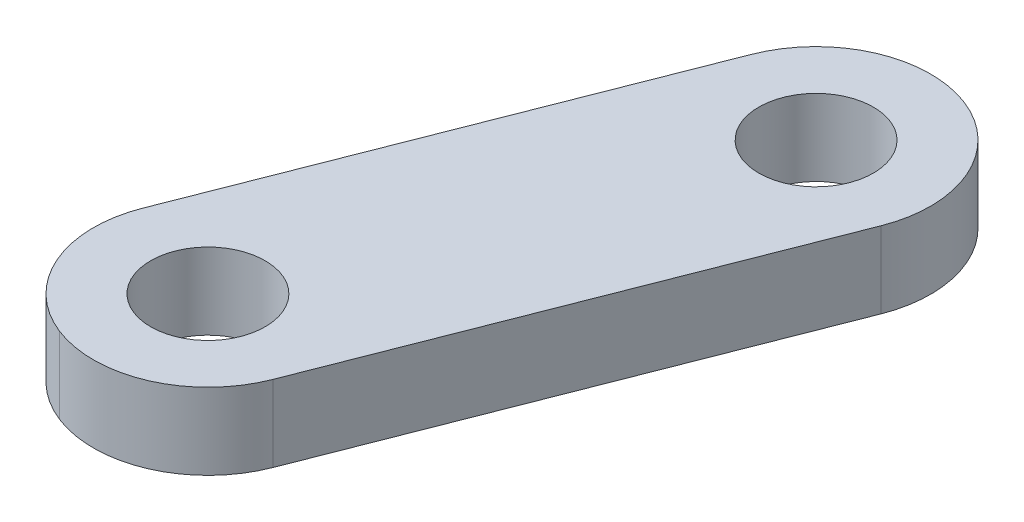
ISO-10303-21;
HEADER;
FILE_DESCRIPTION(('STEP AP214'),'2;1');
FILE_NAME('part.step','',(''),(''),'','','');
FILE_SCHEMA(('AUTOMOTIVE_DESIGN { 1 0 10303 214 1 1 1 1 }'));
ENDSEC;
DATA;
#1=APPLICATION_CONTEXT('core data for automotive mechanical design processes');
#2=APPLICATION_PROTOCOL_DEFINITION('international standard','automotive_design',2000,#1);
#3=PRODUCT_CONTEXT('',#1,'mechanical');
#4=PRODUCT('Part','Part','',(#3));
#5=PRODUCT_RELATED_PRODUCT_CATEGORY('part','',(#4));
#6=PRODUCT_DEFINITION_FORMATION('','',#4);
#7=PRODUCT_DEFINITION_CONTEXT('part definition',#1,'design');
#8=PRODUCT_DEFINITION('design','',#6,#7);
#9=PRODUCT_DEFINITION_SHAPE('','',#8);
#10=(LENGTH_UNIT() NAMED_UNIT(*) SI_UNIT(.MILLI.,.METRE.));
#11=(NAMED_UNIT(*) PLANE_ANGLE_UNIT() SI_UNIT($,.RADIAN.));
#12=(NAMED_UNIT(*) SI_UNIT($,.STERADIAN.) SOLID_ANGLE_UNIT());
#13=UNCERTAINTY_MEASURE_WITH_UNIT(LENGTH_MEASURE(1.E-05),#10,'distance_accuracy_value','');
#14=(GEOMETRIC_REPRESENTATION_CONTEXT(3) GLOBAL_UNCERTAINTY_ASSIGNED_CONTEXT((#13)) GLOBAL_UNIT_ASSIGNED_CONTEXT((#10,
#11,#12)) REPRESENTATION_CONTEXT('',''));
#15=CARTESIAN_POINT('',(0.,0.,0.));
#16=DIRECTION('',(0.,0.,1.));
#17=DIRECTION('',(1.,0.,0.));
#18=AXIS2_PLACEMENT_3D('',#15,#16,#17);
#19=CARTESIAN_POINT('',(0.,6.35,0.));
#20=DIRECTION('',(0.,1.,0.));
#21=DIRECTION('',(0.,0.,1.));
#22=AXIS2_PLACEMENT_3D('',#19,#20,#21);
#23=PLANE('',#22);
#24=CARTESIAN_POINT('',(159.170346838634,6.35,59.494925525367));
#25=DIRECTION('',(0.,1.,0.));
#26=DIRECTION('',(0.,0.,1.));
#27=AXIS2_PLACEMENT_3D('',#24,#25,#26);
#28=CIRCLE('',#27,4.76250000000001);
#29=CARTESIAN_POINT('',(159.170346838634,6.35,64.257425525367));
#30=VERTEX_POINT('',#29);
#31=EDGE_CURVE('E118',#30,#30,#28,.T.);
#32=ORIENTED_EDGE('',*,*,#31,.F.);
#33=EDGE_LOOP('',(#32));
#34=FACE_BOUND('',#33,.T.);
#35=CARTESIAN_POINT('',(144.947006010993,6.35,95.8543294001368));
#36=DIRECTION('',(0.,1.,0.));
#37=DIRECTION('',(0.,0.,1.));
#38=AXIS2_PLACEMENT_3D('',#35,#36,#37);
#39=CIRCLE('',#38,9.525);
#40=CARTESIAN_POINT('',(136.076566564707,6.35,92.3843252171742));
#41=VERTEX_POINT('',#40);
#42=CARTESIAN_POINT('',(141.47700182803,6.35,104.724768846423));
#43=VERTEX_POINT('',#42);
#44=EDGE_CURVE('E50',#41,#43,#39,.T.);
#45=ORIENTED_EDGE('',*,*,#44,.T.);
#46=CARTESIAN_POINT('',(144.947006010993,6.35,95.8543294001368));
#47=DIRECTION('',(0.,1.,0.));
#48=DIRECTION('',(0.,0.,1.));
#49=AXIS2_PLACEMENT_3D('',#46,#47,#48);
#50=CIRCLE('',#49,9.525);
#51=CARTESIAN_POINT('',(153.817445457278,6.35,99.3243335830994));
#52=VERTEX_POINT('',#51);
#53=EDGE_CURVE('E131',#43,#52,#50,.T.);
#54=ORIENTED_EDGE('',*,*,#53,.T.);
#55=DIRECTION('',(0.364304901098435,0.,-0.931279731893516));
#56=VECTOR('',#55,1.);
#57=CARTESIAN_POINT('',(171.510790467882,6.35,54.0944902620439));
#58=LINE('',#57,#56);
#59=CARTESIAN_POINT('',(168.04078628492,6.35,62.9649297083296));
#60=VERTEX_POINT('',#59);
#61=EDGE_CURVE('E107',#52,#60,#58,.T.);
#62=ORIENTED_EDGE('',*,*,#61,.T.);
#63=CARTESIAN_POINT('',(159.170346838634,6.35,59.494925525367));
#64=DIRECTION('',(0.,1.,0.));
#65=DIRECTION('',(0.,0.,1.));
#66=AXIS2_PLACEMENT_3D('',#63,#64,#65);
#67=CIRCLE('',#66,9.525);
#68=CARTESIAN_POINT('',(162.640351021597,6.35,50.6244860790813));
#69=VERTEX_POINT('',#68);
#70=EDGE_CURVE('E97',#60,#69,#67,.T.);
#71=ORIENTED_EDGE('',*,*,#70,.T.);
#72=CARTESIAN_POINT('',(159.170346838634,6.35,59.494925525367));
#73=DIRECTION('',(0.,1.,0.));
#74=DIRECTION('',(0.,0.,1.));
#75=AXIS2_PLACEMENT_3D('',#72,#73,#74);
#76=CIRCLE('',#75,9.525);
#77=CARTESIAN_POINT('',(150.299907392348,6.35,56.0249213424044));
#78=VERTEX_POINT('',#77);
#79=EDGE_CURVE('E128',#69,#78,#76,.T.);
#80=ORIENTED_EDGE('',*,*,#79,.T.);
#81=DIRECTION('',(-0.364304901098434,0.,0.931279731893517));
#82=VECTOR('',#81,1.);
#83=CARTESIAN_POINT('',(153.769911575311,6.35,47.1544818961187));
#84=LINE('',#83,#82);
#85=EDGE_CURVE('E114',#78,#41,#84,.T.);
#86=ORIENTED_EDGE('',*,*,#85,.T.);
#87=EDGE_LOOP('',(#45,#54,#62,#71,#80,#86));
#88=FACE_BOUND('',#87,.T.);
#89=CARTESIAN_POINT('',(144.947006010992,6.35,95.8543294001368));
#90=DIRECTION('',(0.,1.,0.));
#91=DIRECTION('',(0.,0.,1.));
#92=AXIS2_PLACEMENT_3D('',#89,#90,#91);
#93=CIRCLE('',#92,4.76250000000001);
#94=CARTESIAN_POINT('',(144.947006010992,6.35,100.616829400137));
#95=VERTEX_POINT('',#94);
#96=EDGE_CURVE('E136',#95,#95,#93,.T.);
#97=ORIENTED_EDGE('',*,*,#96,.F.);
#98=EDGE_LOOP('',(#97));
#99=FACE_BOUND('',#98,.T.);
#100=ADVANCED_FACE('F33',(#34,#88,#99),#23,.T.);
#101=CARTESIAN_POINT('',(0.,0.,0.));
#102=DIRECTION('',(0.,1.,0.));
#103=DIRECTION('',(0.,0.,1.));
#104=AXIS2_PLACEMENT_3D('',#101,#102,#103);
#105=PLANE('',#104);
#106=DIRECTION('',(0.364304901098435,0.,-0.931279731893516));
#107=VECTOR('',#106,1.);
#108=CARTESIAN_POINT('',(171.510790467882,0.,54.0944902620439));
#109=LINE('',#108,#107);
#110=CARTESIAN_POINT('',(153.817445457278,0.,99.3243335830994));
#111=VERTEX_POINT('',#110);
#112=CARTESIAN_POINT('',(168.04078628492,0.,62.9649297083296));
#113=VERTEX_POINT('',#112);
#114=EDGE_CURVE('E104',#111,#113,#109,.T.);
#115=ORIENTED_EDGE('',*,*,#114,.F.);
#116=CARTESIAN_POINT('',(144.947006010993,0.,95.8543294001368));
#117=DIRECTION('',(0.,1.,0.));
#118=DIRECTION('',(0.,0.,1.));
#119=AXIS2_PLACEMENT_3D('',#116,#117,#118);
#120=CIRCLE('',#119,9.525);
#121=CARTESIAN_POINT('',(141.47700182803,0.,104.724768846423));
#122=VERTEX_POINT('',#121);
#123=EDGE_CURVE('E88',#111,#122,#120,.F.);
#124=ORIENTED_EDGE('',*,*,#123,.T.);
#125=CARTESIAN_POINT('',(144.947006010993,0.,95.8543294001368));
#126=DIRECTION('',(0.,1.,0.));
#127=DIRECTION('',(0.,0.,1.));
#128=AXIS2_PLACEMENT_3D('',#125,#126,#127);
#129=CIRCLE('',#128,9.525);
#130=CARTESIAN_POINT('',(136.076566564707,0.,92.3843252171742));
#131=VERTEX_POINT('',#130);
#132=EDGE_CURVE('E98',#122,#131,#129,.F.);
#133=ORIENTED_EDGE('',*,*,#132,.T.);
#134=DIRECTION('',(-0.364304901098434,0.,0.931279731893517));
#135=VECTOR('',#134,1.);
#136=CARTESIAN_POINT('',(153.769911575311,0.,47.1544818961187));
#137=LINE('',#136,#135);
#138=CARTESIAN_POINT('',(150.299907392348,0.,56.0249213424044));
#139=VERTEX_POINT('',#138);
#140=EDGE_CURVE('E115',#139,#131,#137,.T.);
#141=ORIENTED_EDGE('',*,*,#140,.F.);
#142=CARTESIAN_POINT('',(159.170346838634,0.,59.494925525367));
#143=DIRECTION('',(0.,1.,0.));
#144=DIRECTION('',(0.,0.,1.));
#145=AXIS2_PLACEMENT_3D('',#142,#143,#144);
#146=CIRCLE('',#145,9.525);
#147=CARTESIAN_POINT('',(162.640351021597,0.,50.6244860790813));
#148=VERTEX_POINT('',#147);
#149=EDGE_CURVE('E124',#139,#148,#146,.F.);
#150=ORIENTED_EDGE('',*,*,#149,.T.);
#151=CARTESIAN_POINT('',(159.170346838634,0.,59.494925525367));
#152=DIRECTION('',(0.,1.,0.));
#153=DIRECTION('',(0.,0.,1.));
#154=AXIS2_PLACEMENT_3D('',#151,#152,#153);
#155=CIRCLE('',#154,9.525);
#156=EDGE_CURVE('E108',#148,#113,#155,.F.);
#157=ORIENTED_EDGE('',*,*,#156,.T.);
#158=EDGE_LOOP('',(#115,#124,#133,#141,#150,#157));
#159=FACE_BOUND('',#158,.T.);
#160=CARTESIAN_POINT('',(159.170346838634,0.,59.494925525367));
#161=DIRECTION('',(0.,1.,0.));
#162=DIRECTION('',(0.,0.,1.));
#163=AXIS2_PLACEMENT_3D('',#160,#161,#162);
#164=CIRCLE('',#163,4.76250000000001);
#165=CARTESIAN_POINT('',(159.170346838634,0.,64.257425525367));
#166=VERTEX_POINT('',#165);
#167=EDGE_CURVE('E148',#166,#166,#164,.T.);
#168=ORIENTED_EDGE('',*,*,#167,.T.);
#169=EDGE_LOOP('',(#168));
#170=FACE_BOUND('',#169,.T.);
#171=CARTESIAN_POINT('',(144.947006010992,0.,95.8543294001368));
#172=DIRECTION('',(0.,1.,0.));
#173=DIRECTION('',(0.,0.,1.));
#174=AXIS2_PLACEMENT_3D('',#171,#172,#173);
#175=CIRCLE('',#174,4.76250000000001);
#176=CARTESIAN_POINT('',(144.947006010992,0.,100.616829400137));
#177=VERTEX_POINT('',#176);
#178=EDGE_CURVE('E134',#177,#177,#175,.T.);
#179=ORIENTED_EDGE('',*,*,#178,.T.);
#180=EDGE_LOOP('',(#179));
#181=FACE_BOUND('',#180,.T.);
#182=ADVANCED_FACE('F111',(#159,#170,#181),#105,.F.);
#183=CARTESIAN_POINT('',(153.769911575311,6.35,47.1544818961187));
#184=DIRECTION('',(0.931279731893517,0.,0.364304901098434));
#185=DIRECTION('',(0.364304901098434,0.,-0.931279731893517));
#186=AXIS2_PLACEMENT_3D('',#183,#184,#185);
#187=PLANE('',#186);
#188=ORIENTED_EDGE('',*,*,#140,.T.);
#189=DIRECTION('',(0.,-1.,0.));
#190=VECTOR('',#189,1.);
#191=CARTESIAN_POINT('',(136.076566564707,6.35,92.3843252171742));
#192=LINE('',#191,#190);
#193=EDGE_CURVE('E11',#131,#41,#192,.F.);
#194=ORIENTED_EDGE('',*,*,#193,.T.);
#195=ORIENTED_EDGE('',*,*,#85,.F.);
#196=DIRECTION('',(0.,-1.,0.));
#197=VECTOR('',#196,1.);
#198=CARTESIAN_POINT('',(150.299907392348,6.35,56.0249213424044));
#199=LINE('',#198,#197);
#200=EDGE_CURVE('E42',#78,#139,#199,.T.);
#201=ORIENTED_EDGE('',*,*,#200,.T.);
#202=EDGE_LOOP('',(#188,#194,#195,#201));
#203=FACE_BOUND('',#202,.T.);
#204=ADVANCED_FACE('F164',(#203),#187,.F.);
#205=CARTESIAN_POINT('',(171.510790467882,6.35,54.0944902620439));
#206=DIRECTION('',(-0.931279731893516,0.,-0.364304901098435));
#207=DIRECTION('',(-0.364304901098435,0.,0.931279731893517));
#208=AXIS2_PLACEMENT_3D('',#205,#206,#207);
#209=PLANE('',#208);
#210=ORIENTED_EDGE('',*,*,#61,.F.);
#211=DIRECTION('',(0.,-1.,0.));
#212=VECTOR('',#211,1.);
#213=CARTESIAN_POINT('',(153.817445457278,6.35,99.3243335830994));
#214=LINE('',#213,#212);
#215=EDGE_CURVE('E92',#52,#111,#214,.T.);
#216=ORIENTED_EDGE('',*,*,#215,.T.);
#217=ORIENTED_EDGE('',*,*,#114,.T.);
#218=DIRECTION('',(0.,-1.,0.));
#219=VECTOR('',#218,1.);
#220=CARTESIAN_POINT('',(168.04078628492,6.35,62.9649297083296));
#221=LINE('',#220,#219);
#222=EDGE_CURVE('E109',#113,#60,#221,.F.);
#223=ORIENTED_EDGE('',*,*,#222,.T.);
#224=EDGE_LOOP('',(#210,#216,#217,#223));
#225=FACE_BOUND('',#224,.T.);
#226=ADVANCED_FACE('F103',(#225),#209,.F.);
#227=CARTESIAN_POINT('',(159.170346838634,6.35,59.494925525367));
#228=DIRECTION('',(0.,-1.,0.));
#229=DIRECTION('',(0.,0.,-1.));
#230=AXIS2_PLACEMENT_3D('',#227,#228,#229);
#231=CYLINDRICAL_SURFACE('',#230,4.76250000000001);
#232=ORIENTED_EDGE('',*,*,#31,.T.);
#233=EDGE_LOOP('',(#232));
#234=FACE_BOUND('',#233,.T.);
#235=ORIENTED_EDGE('',*,*,#167,.F.);
#236=EDGE_LOOP('',(#235));
#237=FACE_BOUND('',#236,.T.);
#238=ADVANCED_FACE('F168',(#234,#237),#231,.F.);
#239=CARTESIAN_POINT('',(144.947006010992,6.35,95.8543294001368));
#240=DIRECTION('',(0.,-1.,0.));
#241=DIRECTION('',(0.,0.,-1.));
#242=AXIS2_PLACEMENT_3D('',#239,#240,#241);
#243=CYLINDRICAL_SURFACE('',#242,4.76250000000001);
#244=ORIENTED_EDGE('',*,*,#96,.T.);
#245=EDGE_LOOP('',(#244));
#246=FACE_BOUND('',#245,.T.);
#247=ORIENTED_EDGE('',*,*,#178,.F.);
#248=EDGE_LOOP('',(#247));
#249=FACE_BOUND('',#248,.T.);
#250=ADVANCED_FACE('F156',(#246,#249),#243,.F.);
#251=CARTESIAN_POINT('',(144.947006010993,6.35,95.8543294001368));
#252=DIRECTION('',(0.,-1.,0.));
#253=DIRECTION('',(0.,0.,-1.));
#254=AXIS2_PLACEMENT_3D('',#251,#252,#253);
#255=CYLINDRICAL_SURFACE('',#254,9.525);
#256=DIRECTION('',(0.,-1.,0.));
#257=VECTOR('',#256,1.);
#258=CARTESIAN_POINT('',(141.47700182803,6.35,104.724768846423));
#259=LINE('',#258,#257);
#260=EDGE_CURVE('E93',#43,#122,#259,.T.);
#261=ORIENTED_EDGE('',*,*,#260,.F.);
#262=ORIENTED_EDGE('',*,*,#44,.F.);
#263=ORIENTED_EDGE('',*,*,#193,.F.);
#264=ORIENTED_EDGE('',*,*,#132,.F.);
#265=EDGE_LOOP('',(#261,#262,#263,#264));
#266=FACE_BOUND('',#265,.T.);
#267=ADVANCED_FACE('F177',(#266),#255,.T.);
#268=CARTESIAN_POINT('',(144.947006010993,6.35,95.8543294001368));
#269=DIRECTION('',(0.,-1.,0.));
#270=DIRECTION('',(0.,0.,-1.));
#271=AXIS2_PLACEMENT_3D('',#268,#269,#270);
#272=CYLINDRICAL_SURFACE('',#271,9.525);
#273=ORIENTED_EDGE('',*,*,#53,.F.);
#274=ORIENTED_EDGE('',*,*,#260,.T.);
#275=ORIENTED_EDGE('',*,*,#123,.F.);
#276=ORIENTED_EDGE('',*,*,#215,.F.);
#277=EDGE_LOOP('',(#273,#274,#275,#276));
#278=FACE_BOUND('',#277,.T.);
#279=ADVANCED_FACE('F91',(#278),#272,.T.);
#280=CARTESIAN_POINT('',(159.170346838634,6.35,59.494925525367));
#281=DIRECTION('',(0.,-1.,0.));
#282=DIRECTION('',(0.,0.,-1.));
#283=AXIS2_PLACEMENT_3D('',#280,#281,#282);
#284=CYLINDRICAL_SURFACE('',#283,9.525);
#285=DIRECTION('',(0.,-1.,0.));
#286=VECTOR('',#285,1.);
#287=CARTESIAN_POINT('',(162.640351021597,6.35,50.6244860790813));
#288=LINE('',#287,#286);
#289=EDGE_CURVE('E37',#69,#148,#288,.T.);
#290=ORIENTED_EDGE('',*,*,#289,.F.);
#291=ORIENTED_EDGE('',*,*,#70,.F.);
#292=ORIENTED_EDGE('',*,*,#222,.F.);
#293=ORIENTED_EDGE('',*,*,#156,.F.);
#294=EDGE_LOOP('',(#290,#291,#292,#293));
#295=FACE_BOUND('',#294,.T.);
#296=ADVANCED_FACE('F35',(#295),#284,.T.);
#297=CARTESIAN_POINT('',(159.170346838634,6.35,59.494925525367));
#298=DIRECTION('',(0.,-1.,0.));
#299=DIRECTION('',(0.,0.,-1.));
#300=AXIS2_PLACEMENT_3D('',#297,#298,#299);
#301=CYLINDRICAL_SURFACE('',#300,9.525);
#302=ORIENTED_EDGE('',*,*,#79,.F.);
#303=ORIENTED_EDGE('',*,*,#289,.T.);
#304=ORIENTED_EDGE('',*,*,#149,.F.);
#305=ORIENTED_EDGE('',*,*,#200,.F.);
#306=EDGE_LOOP('',(#302,#303,#304,#305));
#307=FACE_BOUND('',#306,.T.);
#308=ADVANCED_FACE('F142',(#307),#301,.T.);
#309=CLOSED_SHELL('',(#100,#182,#204,#226,#238,#250,#267,#279,#296,#308));
#310=MANIFOLD_SOLID_BREP('B2',#309);
#311=ADVANCED_BREP_SHAPE_REPRESENTATION('',(#18,#310),#14);
#312=SHAPE_DEFINITION_REPRESENTATION(#9,#311);
ENDSEC;
END-ISO-10303-21;
